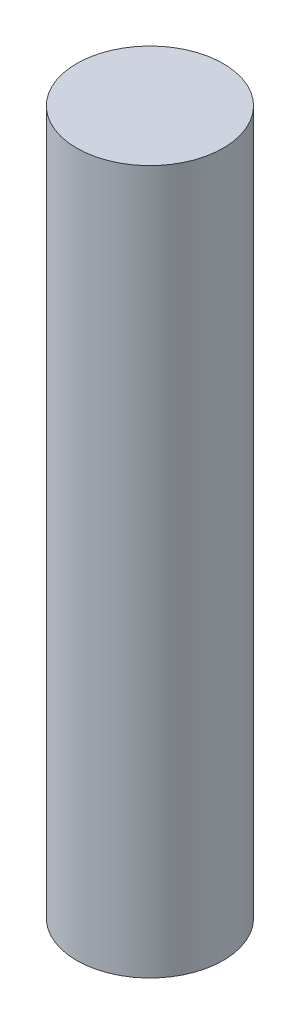
ISO-10303-21;
HEADER;
FILE_DESCRIPTION(('STEP AP214'),'2;1');
FILE_NAME('part.step','',(''),(''),'','','');
FILE_SCHEMA(('AUTOMOTIVE_DESIGN { 1 0 10303 214 1 1 1 1 }'));
ENDSEC;
DATA;
#1=APPLICATION_CONTEXT('core data for automotive mechanical design processes');
#2=APPLICATION_PROTOCOL_DEFINITION('international standard','automotive_design',2000,#1);
#3=PRODUCT_CONTEXT('',#1,'mechanical');
#4=PRODUCT('Part','Part','',(#3));
#5=PRODUCT_RELATED_PRODUCT_CATEGORY('part','',(#4));
#6=PRODUCT_DEFINITION_FORMATION('','',#4);
#7=PRODUCT_DEFINITION_CONTEXT('part definition',#1,'design');
#8=PRODUCT_DEFINITION('design','',#6,#7);
#9=PRODUCT_DEFINITION_SHAPE('','',#8);
#10=(LENGTH_UNIT() NAMED_UNIT(*) SI_UNIT(.MILLI.,.METRE.));
#11=(NAMED_UNIT(*) PLANE_ANGLE_UNIT() SI_UNIT($,.RADIAN.));
#12=(NAMED_UNIT(*) SI_UNIT($,.STERADIAN.) SOLID_ANGLE_UNIT());
#13=UNCERTAINTY_MEASURE_WITH_UNIT(LENGTH_MEASURE(1.E-05),#10,'distance_accuracy_value','');
#14=(GEOMETRIC_REPRESENTATION_CONTEXT(3) GLOBAL_UNCERTAINTY_ASSIGNED_CONTEXT((#13)) GLOBAL_UNIT_ASSIGNED_CONTEXT((#10,
#11,#12)) REPRESENTATION_CONTEXT('',''));
#15=CARTESIAN_POINT('',(0.,0.,0.));
#16=DIRECTION('',(0.,0.,1.));
#17=DIRECTION('',(1.,0.,0.));
#18=AXIS2_PLACEMENT_3D('',#15,#16,#17);
#19=CARTESIAN_POINT('',(0.,72.,0.));
#20=DIRECTION('',(0.,-1.,0.));
#21=DIRECTION('',(0.,0.,-1.));
#22=AXIS2_PLACEMENT_3D('',#19,#20,#21);
#23=CYLINDRICAL_SURFACE('',#22,7.5);
#24=CARTESIAN_POINT('',(0.,72.,0.));
#25=DIRECTION('',(0.,1.,0.));
#26=DIRECTION('',(0.,0.,1.));
#27=AXIS2_PLACEMENT_3D('',#24,#25,#26);
#28=CIRCLE('',#27,7.5);
#29=CARTESIAN_POINT('',(0.,72.,7.5));
#30=VERTEX_POINT('',#29);
#31=EDGE_CURVE('E10',#30,#30,#28,.T.);
#32=ORIENTED_EDGE('',*,*,#31,.F.);
#33=EDGE_LOOP('',(#32));
#34=FACE_BOUND('',#33,.T.);
#35=CARTESIAN_POINT('',(0.,0.,0.));
#36=DIRECTION('',(0.,1.,0.));
#37=DIRECTION('',(0.,0.,1.));
#38=AXIS2_PLACEMENT_3D('',#35,#36,#37);
#39=CIRCLE('',#38,7.5);
#40=CARTESIAN_POINT('',(0.,0.,7.5));
#41=VERTEX_POINT('',#40);
#42=EDGE_CURVE('E45',#41,#41,#39,.T.);
#43=ORIENTED_EDGE('',*,*,#42,.T.);
#44=EDGE_LOOP('',(#43));
#45=FACE_BOUND('',#44,.T.);
#46=ADVANCED_FACE('F42',(#34,#45),#23,.T.);
#47=CARTESIAN_POINT('',(0.,72.,0.));
#48=DIRECTION('',(0.,1.,0.));
#49=DIRECTION('',(0.,0.,1.));
#50=AXIS2_PLACEMENT_3D('',#47,#48,#49);
#51=PLANE('',#50);
#52=ORIENTED_EDGE('',*,*,#31,.T.);
#53=EDGE_LOOP('',(#52));
#54=FACE_BOUND('',#53,.T.);
#55=ADVANCED_FACE('F59',(#54),#51,.T.);
#56=CARTESIAN_POINT('',(0.,0.,0.));
#57=DIRECTION('',(0.,1.,0.));
#58=DIRECTION('',(0.,0.,1.));
#59=AXIS2_PLACEMENT_3D('',#56,#57,#58);
#60=PLANE('',#59);
#61=ORIENTED_EDGE('',*,*,#42,.F.);
#62=EDGE_LOOP('',(#61));
#63=FACE_BOUND('',#62,.T.);
#64=ADVANCED_FACE('F57',(#63),#60,.F.);
#65=CLOSED_SHELL('',(#46,#55,#64));
#66=MANIFOLD_SOLID_BREP('B2',#65);
#67=ADVANCED_BREP_SHAPE_REPRESENTATION('',(#18,#66),#14);
#68=SHAPE_DEFINITION_REPRESENTATION(#9,#67);
ENDSEC;
END-ISO-10303-21;
